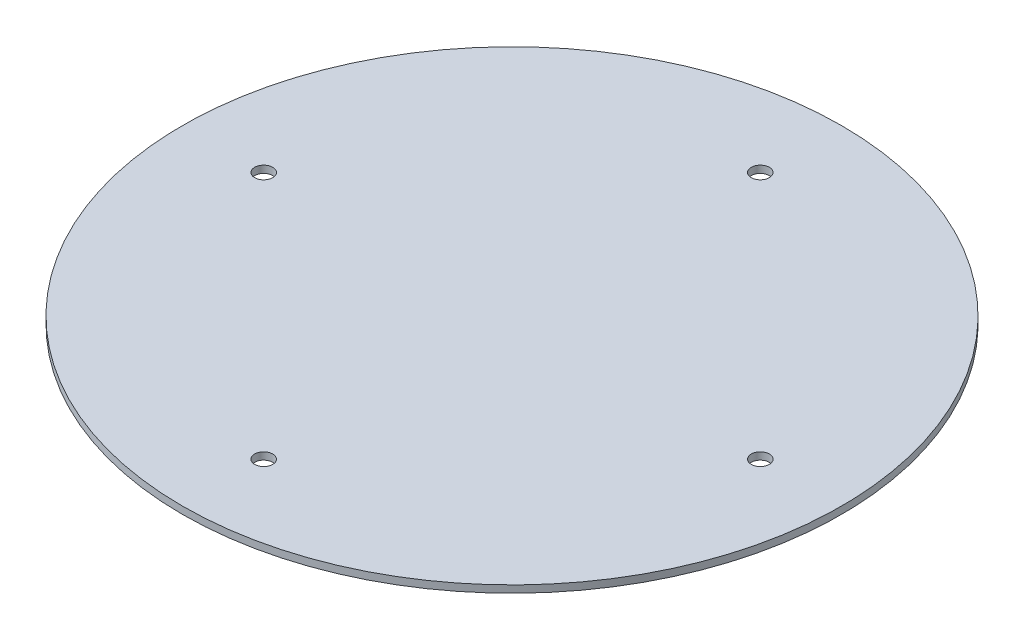
ISO-10303-21;
HEADER;
FILE_DESCRIPTION(('STEP AP214'),'2;1');
FILE_NAME('part.step','',(''),(''),'','','');
FILE_SCHEMA(('AUTOMOTIVE_DESIGN { 1 0 10303 214 1 1 1 1 }'));
ENDSEC;
DATA;
#1=APPLICATION_CONTEXT('core data for automotive mechanical design processes');
#2=APPLICATION_PROTOCOL_DEFINITION('international standard','automotive_design',2000,#1);
#3=PRODUCT_CONTEXT('',#1,'mechanical');
#4=PRODUCT('Part','Part','',(#3));
#5=PRODUCT_RELATED_PRODUCT_CATEGORY('part','',(#4));
#6=PRODUCT_DEFINITION_FORMATION('','',#4);
#7=PRODUCT_DEFINITION_CONTEXT('part definition',#1,'design');
#8=PRODUCT_DEFINITION('design','',#6,#7);
#9=PRODUCT_DEFINITION_SHAPE('','',#8);
#10=(LENGTH_UNIT() NAMED_UNIT(*) SI_UNIT(.MILLI.,.METRE.));
#11=(NAMED_UNIT(*) PLANE_ANGLE_UNIT() SI_UNIT($,.RADIAN.));
#12=(NAMED_UNIT(*) SI_UNIT($,.STERADIAN.) SOLID_ANGLE_UNIT());
#13=UNCERTAINTY_MEASURE_WITH_UNIT(LENGTH_MEASURE(1.E-05),#10,'distance_accuracy_value','');
#14=(GEOMETRIC_REPRESENTATION_CONTEXT(3) GLOBAL_UNCERTAINTY_ASSIGNED_CONTEXT((#13)) GLOBAL_UNIT_ASSIGNED_CONTEXT((#10,
#11,#12)) REPRESENTATION_CONTEXT('',''));
#15=CARTESIAN_POINT('',(0.,0.,0.));
#16=DIRECTION('',(0.,0.,1.));
#17=DIRECTION('',(1.,0.,0.));
#18=AXIS2_PLACEMENT_3D('',#15,#16,#17);
#19=CARTESIAN_POINT('',(0.,1.6,0.));
#20=DIRECTION('',(0.,-1.,0.));
#21=DIRECTION('',(0.,0.,-1.));
#22=AXIS2_PLACEMENT_3D('',#19,#20,#21);
#23=CYLINDRICAL_SURFACE('',#22,73.);
#24=CARTESIAN_POINT('',(0.,1.6,0.));
#25=DIRECTION('',(0.,1.,0.));
#26=DIRECTION('',(0.,0.,1.));
#27=AXIS2_PLACEMENT_3D('',#24,#25,#26);
#28=CIRCLE('',#27,73.);
#29=CARTESIAN_POINT('',(0.,1.6,73.));
#30=VERTEX_POINT('',#29);
#31=EDGE_CURVE('E10',#30,#30,#28,.T.);
#32=ORIENTED_EDGE('',*,*,#31,.F.);
#33=EDGE_LOOP('',(#32));
#34=FACE_BOUND('',#33,.T.);
#35=CARTESIAN_POINT('',(0.,0.,0.));
#36=DIRECTION('',(0.,1.,0.));
#37=DIRECTION('',(0.,0.,1.));
#38=AXIS2_PLACEMENT_3D('',#35,#36,#37);
#39=CIRCLE('',#38,73.);
#40=CARTESIAN_POINT('',(0.,0.,73.));
#41=VERTEX_POINT('',#40);
#42=EDGE_CURVE('E48',#41,#41,#39,.T.);
#43=ORIENTED_EDGE('',*,*,#42,.T.);
#44=EDGE_LOOP('',(#43));
#45=FACE_BOUND('',#44,.T.);
#46=ADVANCED_FACE('F45',(#34,#45),#23,.T.);
#47=CARTESIAN_POINT('',(0.,1.6,0.));
#48=DIRECTION('',(0.,1.,0.));
#49=DIRECTION('',(0.,0.,1.));
#50=AXIS2_PLACEMENT_3D('',#47,#48,#49);
#51=PLANE('',#50);
#52=CARTESIAN_POINT('',(0.,1.6,-55.));
#53=DIRECTION('',(0.,1.,0.));
#54=DIRECTION('',(0.,0.,1.));
#55=AXIS2_PLACEMENT_3D('',#52,#53,#54);
#56=CIRCLE('',#55,1.99999999999999);
#57=CARTESIAN_POINT('',(0.,1.6,-53.));
#58=VERTEX_POINT('',#57);
#59=EDGE_CURVE('E77',#58,#58,#56,.T.);
#60=ORIENTED_EDGE('',*,*,#59,.F.);
#61=EDGE_LOOP('',(#60));
#62=FACE_BOUND('',#61,.T.);
#63=CARTESIAN_POINT('',(55.,1.6,0.));
#64=DIRECTION('',(0.,1.,0.));
#65=DIRECTION('',(0.,0.,1.));
#66=AXIS2_PLACEMENT_3D('',#63,#64,#65);
#67=CIRCLE('',#66,1.99999999999999);
#68=CARTESIAN_POINT('',(55.,1.6,1.99999999999997));
#69=VERTEX_POINT('',#68);
#70=EDGE_CURVE('E71',#69,#69,#67,.T.);
#71=ORIENTED_EDGE('',*,*,#70,.F.);
#72=EDGE_LOOP('',(#71));
#73=FACE_BOUND('',#72,.T.);
#74=CARTESIAN_POINT('',(-55.,1.6,0.));
#75=DIRECTION('',(0.,1.,0.));
#76=DIRECTION('',(0.,0.,1.));
#77=AXIS2_PLACEMENT_3D('',#74,#75,#76);
#78=CIRCLE('',#77,1.99999999999999);
#79=CARTESIAN_POINT('',(-55.,1.6,1.99999999999999));
#80=VERTEX_POINT('',#79);
#81=EDGE_CURVE('E65',#80,#80,#78,.T.);
#82=ORIENTED_EDGE('',*,*,#81,.F.);
#83=EDGE_LOOP('',(#82));
#84=FACE_BOUND('',#83,.T.);
#85=CARTESIAN_POINT('',(0.,1.6,55.));
#86=DIRECTION('',(0.,1.,0.));
#87=DIRECTION('',(0.,0.,1.));
#88=AXIS2_PLACEMENT_3D('',#85,#86,#87);
#89=CIRCLE('',#88,1.99999999999999);
#90=CARTESIAN_POINT('',(0.,1.6,57.));
#91=VERTEX_POINT('',#90);
#92=EDGE_CURVE('E59',#91,#91,#89,.T.);
#93=ORIENTED_EDGE('',*,*,#92,.F.);
#94=EDGE_LOOP('',(#93));
#95=FACE_BOUND('',#94,.T.);
#96=ORIENTED_EDGE('',*,*,#31,.T.);
#97=EDGE_LOOP('',(#96));
#98=FACE_BOUND('',#97,.T.);
#99=ADVANCED_FACE('F83',(#62,#73,#84,#95,#98),#51,.T.);
#100=CARTESIAN_POINT('',(0.,0.,0.));
#101=DIRECTION('',(0.,1.,0.));
#102=DIRECTION('',(0.,0.,1.));
#103=AXIS2_PLACEMENT_3D('',#100,#101,#102);
#104=PLANE('',#103);
#105=CARTESIAN_POINT('',(0.,0.,-55.));
#106=DIRECTION('',(0.,1.,0.));
#107=DIRECTION('',(0.,0.,1.));
#108=AXIS2_PLACEMENT_3D('',#105,#106,#107);
#109=CIRCLE('',#108,2.);
#110=CARTESIAN_POINT('',(0.,0.,-53.));
#111=VERTEX_POINT('',#110);
#112=EDGE_CURVE('E74',#111,#111,#109,.T.);
#113=ORIENTED_EDGE('',*,*,#112,.T.);
#114=EDGE_LOOP('',(#113));
#115=FACE_BOUND('',#114,.T.);
#116=CARTESIAN_POINT('',(55.,0.,0.));
#117=DIRECTION('',(0.,1.,0.));
#118=DIRECTION('',(0.,0.,1.));
#119=AXIS2_PLACEMENT_3D('',#116,#117,#118);
#120=CIRCLE('',#119,2.);
#121=CARTESIAN_POINT('',(55.,0.,1.99999999999998));
#122=VERTEX_POINT('',#121);
#123=EDGE_CURVE('E68',#122,#122,#120,.T.);
#124=ORIENTED_EDGE('',*,*,#123,.T.);
#125=EDGE_LOOP('',(#124));
#126=FACE_BOUND('',#125,.T.);
#127=CARTESIAN_POINT('',(-55.,0.,0.));
#128=DIRECTION('',(0.,1.,0.));
#129=DIRECTION('',(0.,0.,1.));
#130=AXIS2_PLACEMENT_3D('',#127,#128,#129);
#131=CIRCLE('',#130,2.);
#132=CARTESIAN_POINT('',(-55.,0.,2.));
#133=VERTEX_POINT('',#132);
#134=EDGE_CURVE('E62',#133,#133,#131,.T.);
#135=ORIENTED_EDGE('',*,*,#134,.T.);
#136=EDGE_LOOP('',(#135));
#137=FACE_BOUND('',#136,.T.);
#138=CARTESIAN_POINT('',(0.,0.,55.));
#139=DIRECTION('',(0.,1.,0.));
#140=DIRECTION('',(0.,0.,1.));
#141=AXIS2_PLACEMENT_3D('',#138,#139,#140);
#142=CIRCLE('',#141,2.);
#143=CARTESIAN_POINT('',(0.,0.,57.));
#144=VERTEX_POINT('',#143);
#145=EDGE_CURVE('E55',#144,#144,#142,.T.);
#146=ORIENTED_EDGE('',*,*,#145,.T.);
#147=EDGE_LOOP('',(#146));
#148=FACE_BOUND('',#147,.T.);
#149=ORIENTED_EDGE('',*,*,#42,.F.);
#150=EDGE_LOOP('',(#149));
#151=FACE_BOUND('',#150,.T.);
#152=ADVANCED_FACE('F86',(#115,#126,#137,#148,#151),#104,.F.);
#153=CARTESIAN_POINT('',(0.,1.6,55.));
#154=DIRECTION('',(0.,1.,0.));
#155=DIRECTION('',(0.,0.,1.));
#156=AXIS2_PLACEMENT_3D('',#153,#154,#155);
#157=CYLINDRICAL_SURFACE('',#156,1.99999999999999);
#158=ORIENTED_EDGE('',*,*,#145,.F.);
#159=EDGE_LOOP('',(#158));
#160=FACE_BOUND('',#159,.T.);
#161=ORIENTED_EDGE('',*,*,#92,.T.);
#162=EDGE_LOOP('',(#161));
#163=FACE_BOUND('',#162,.T.);
#164=ADVANCED_FACE('F94',(#160,#163),#157,.F.);
#165=CARTESIAN_POINT('',(-55.,1.6,0.));
#166=DIRECTION('',(0.,1.,0.));
#167=DIRECTION('',(0.,0.,1.));
#168=AXIS2_PLACEMENT_3D('',#165,#166,#167);
#169=CYLINDRICAL_SURFACE('',#168,1.99999999999999);
#170=ORIENTED_EDGE('',*,*,#134,.F.);
#171=EDGE_LOOP('',(#170));
#172=FACE_BOUND('',#171,.T.);
#173=ORIENTED_EDGE('',*,*,#81,.T.);
#174=EDGE_LOOP('',(#173));
#175=FACE_BOUND('',#174,.T.);
#176=ADVANCED_FACE('F96',(#172,#175),#169,.F.);
#177=CARTESIAN_POINT('',(55.,1.6,0.));
#178=DIRECTION('',(0.,1.,0.));
#179=DIRECTION('',(0.,0.,1.));
#180=AXIS2_PLACEMENT_3D('',#177,#178,#179);
#181=CYLINDRICAL_SURFACE('',#180,1.99999999999999);
#182=ORIENTED_EDGE('',*,*,#123,.F.);
#183=EDGE_LOOP('',(#182));
#184=FACE_BOUND('',#183,.T.);
#185=ORIENTED_EDGE('',*,*,#70,.T.);
#186=EDGE_LOOP('',(#185));
#187=FACE_BOUND('',#186,.T.);
#188=ADVANCED_FACE('F103',(#184,#187),#181,.F.);
#189=CARTESIAN_POINT('',(0.,1.6,-55.));
#190=DIRECTION('',(0.,1.,0.));
#191=DIRECTION('',(0.,0.,1.));
#192=AXIS2_PLACEMENT_3D('',#189,#190,#191);
#193=CYLINDRICAL_SURFACE('',#192,1.99999999999999);
#194=ORIENTED_EDGE('',*,*,#112,.F.);
#195=EDGE_LOOP('',(#194));
#196=FACE_BOUND('',#195,.T.);
#197=ORIENTED_EDGE('',*,*,#59,.T.);
#198=EDGE_LOOP('',(#197));
#199=FACE_BOUND('',#198,.T.);
#200=ADVANCED_FACE('F81',(#196,#199),#193,.F.);
#201=CLOSED_SHELL('',(#46,#99,#152,#164,#176,#188,#200));
#202=MANIFOLD_SOLID_BREP('B2',#201);
#203=ADVANCED_BREP_SHAPE_REPRESENTATION('',(#18,#202),#14);
#204=SHAPE_DEFINITION_REPRESENTATION(#9,#203);
ENDSEC;
END-ISO-10303-21;
